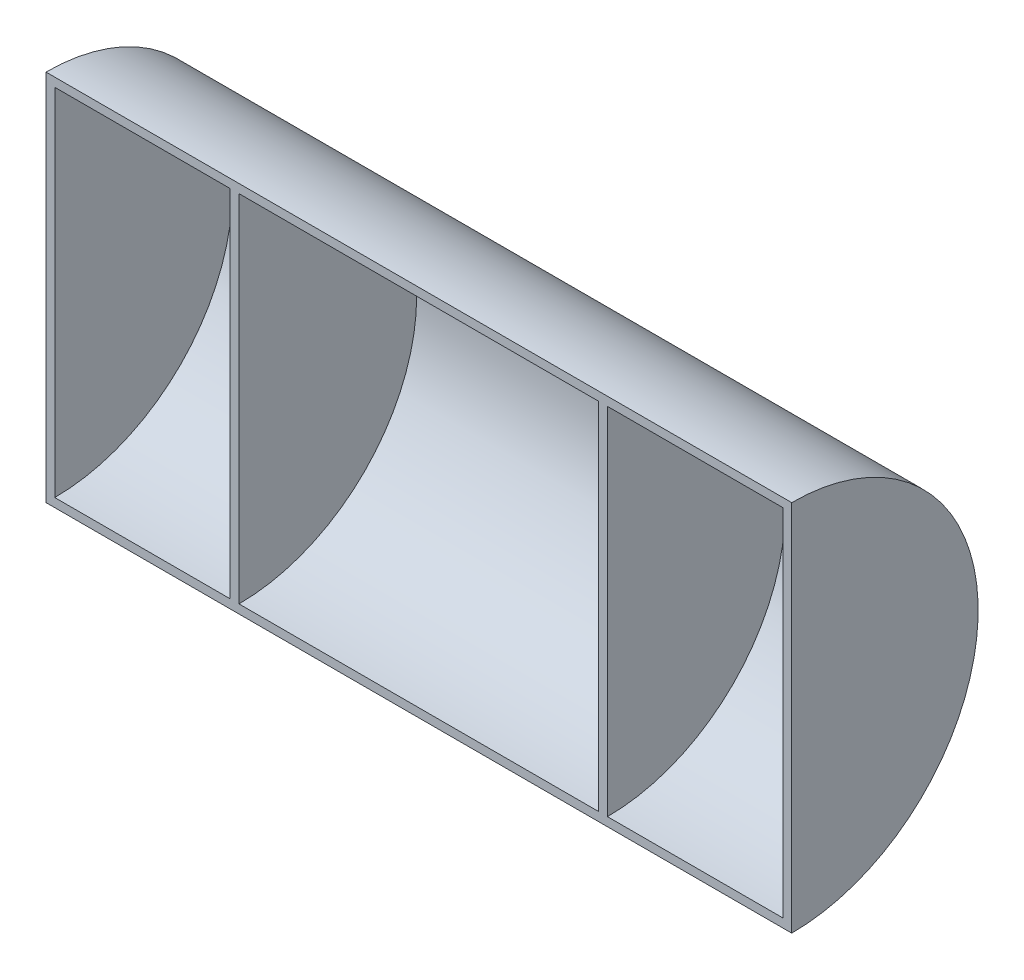
ISO-10303-21;
HEADER;
FILE_DESCRIPTION(('STEP AP214'),'2;1');
FILE_NAME('part.step','',(''),(''),'','','');
FILE_SCHEMA(('AUTOMOTIVE_DESIGN { 1 0 10303 214 1 1 1 1 }'));
ENDSEC;
DATA;
#1=APPLICATION_CONTEXT('core data for automotive mechanical design processes');
#2=APPLICATION_PROTOCOL_DEFINITION('international standard','automotive_design',2000,#1);
#3=PRODUCT_CONTEXT('',#1,'mechanical');
#4=PRODUCT('Part','Part','',(#3));
#5=PRODUCT_RELATED_PRODUCT_CATEGORY('part','',(#4));
#6=PRODUCT_DEFINITION_FORMATION('','',#4);
#7=PRODUCT_DEFINITION_CONTEXT('part definition',#1,'design');
#8=PRODUCT_DEFINITION('design','',#6,#7);
#9=PRODUCT_DEFINITION_SHAPE('','',#8);
#10=(LENGTH_UNIT() NAMED_UNIT(*) SI_UNIT(.MILLI.,.METRE.));
#11=(NAMED_UNIT(*) PLANE_ANGLE_UNIT() SI_UNIT($,.RADIAN.));
#12=(NAMED_UNIT(*) SI_UNIT($,.STERADIAN.) SOLID_ANGLE_UNIT());
#13=UNCERTAINTY_MEASURE_WITH_UNIT(LENGTH_MEASURE(1.E-05),#10,'distance_accuracy_value','');
#14=(GEOMETRIC_REPRESENTATION_CONTEXT(3) GLOBAL_UNCERTAINTY_ASSIGNED_CONTEXT((#13)) GLOBAL_UNIT_ASSIGNED_CONTEXT((#10,
#11,#12)) REPRESENTATION_CONTEXT('',''));
#15=CARTESIAN_POINT('',(0.,0.,0.));
#16=DIRECTION('',(0.,0.,1.));
#17=DIRECTION('',(1.,0.,0.));
#18=AXIS2_PLACEMENT_3D('',#15,#16,#17);
#19=CARTESIAN_POINT('',(-170.,0.,0.));
#20=DIRECTION('',(1.,0.,0.));
#21=DIRECTION('',(0.,0.,-1.));
#22=AXIS2_PLACEMENT_3D('',#19,#20,#21);
#23=CYLINDRICAL_SURFACE('',#22,40.5);
#24=DIRECTION('',(1.,0.,0.));
#25=VECTOR('',#24,1.);
#26=CARTESIAN_POINT('',(-168.,-40.5,0.));
#27=LINE('',#26,#25);
#28=CARTESIAN_POINT('',(-126.,-40.5,0.));
#29=VERTEX_POINT('',#28);
#30=CARTESIAN_POINT('',(-44.,-40.5,0.));
#31=VERTEX_POINT('',#30);
#32=EDGE_CURVE('E111',#29,#31,#27,.T.);
#33=ORIENTED_EDGE('',*,*,#32,.T.);
#34=CARTESIAN_POINT('',(-44.,0.,0.));
#35=DIRECTION('',(-1.,0.,0.));
#36=DIRECTION('',(0.,0.,1.));
#37=AXIS2_PLACEMENT_3D('',#34,#35,#36);
#38=CIRCLE('',#37,40.5);
#39=CARTESIAN_POINT('',(-44.,40.5,0.));
#40=VERTEX_POINT('',#39);
#41=EDGE_CURVE('E102',#40,#31,#38,.T.);
#42=ORIENTED_EDGE('',*,*,#41,.F.);
#43=DIRECTION('',(1.,0.,0.));
#44=VECTOR('',#43,1.);
#45=CARTESIAN_POINT('',(-168.,40.5,0.));
#46=LINE('',#45,#44);
#47=CARTESIAN_POINT('',(-126.,40.5,0.));
#48=VERTEX_POINT('',#47);
#49=EDGE_CURVE('E110',#48,#40,#46,.T.);
#50=ORIENTED_EDGE('',*,*,#49,.F.);
#51=CARTESIAN_POINT('',(-126.,0.,0.));
#52=DIRECTION('',(1.,0.,0.));
#53=DIRECTION('',(0.,0.,-1.));
#54=AXIS2_PLACEMENT_3D('',#51,#52,#53);
#55=CIRCLE('',#54,40.5);
#56=EDGE_CURVE('E190',#29,#48,#55,.T.);
#57=ORIENTED_EDGE('',*,*,#56,.F.);
#58=EDGE_LOOP('',(#33,#42,#50,#57));
#59=FACE_BOUND('',#58,.T.);
#60=ADVANCED_FACE('F36',(#59),#23,.F.);
#61=CARTESIAN_POINT('',(-168.,-40.5,0.));
#62=VERTEX_POINT('',#61);
#63=CARTESIAN_POINT('',(-128.,-40.5,0.));
#64=VERTEX_POINT('',#63);
#65=EDGE_CURVE('E138',#62,#64,#27,.T.);
#66=ORIENTED_EDGE('',*,*,#65,.T.);
#67=CARTESIAN_POINT('',(-128.,0.,0.));
#68=DIRECTION('',(-1.,0.,0.));
#69=DIRECTION('',(0.,0.,1.));
#70=AXIS2_PLACEMENT_3D('',#67,#68,#69);
#71=CIRCLE('',#70,40.5);
#72=CARTESIAN_POINT('',(-128.,40.5,0.));
#73=VERTEX_POINT('',#72);
#74=EDGE_CURVE('E187',#73,#64,#71,.T.);
#75=ORIENTED_EDGE('',*,*,#74,.F.);
#76=CARTESIAN_POINT('',(-168.,40.5,0.));
#77=VERTEX_POINT('',#76);
#78=EDGE_CURVE('E116',#77,#73,#46,.T.);
#79=ORIENTED_EDGE('',*,*,#78,.F.);
#80=CARTESIAN_POINT('',(-168.,0.,0.));
#81=DIRECTION('',(1.,0.,0.));
#82=DIRECTION('',(0.,0.,-1.));
#83=AXIS2_PLACEMENT_3D('',#80,#81,#82);
#84=CIRCLE('',#83,40.5);
#85=EDGE_CURVE('E127',#62,#77,#84,.T.);
#86=ORIENTED_EDGE('',*,*,#85,.F.);
#87=EDGE_LOOP('',(#66,#75,#79,#86));
#88=FACE_BOUND('',#87,.T.);
#89=ADVANCED_FACE('F160',(#88),#23,.F.);
#90=CARTESIAN_POINT('',(-170.,42.5,0.));
#91=DIRECTION('',(0.,0.,1.));
#92=DIRECTION('',(1.,0.,0.));
#93=AXIS2_PLACEMENT_3D('',#90,#91,#92);
#94=PLANE('',#93);
#95=CARTESIAN_POINT('',(-42.,-40.5,0.));
#96=VERTEX_POINT('',#95);
#97=CARTESIAN_POINT('',(-2.,-40.5,0.));
#98=VERTEX_POINT('',#97);
#99=EDGE_CURVE('E120',#96,#98,#27,.T.);
#100=ORIENTED_EDGE('',*,*,#99,.F.);
#101=DIRECTION('',(0.,1.,0.));
#102=VECTOR('',#101,1.);
#103=CARTESIAN_POINT('',(-42.,40.5,0.));
#104=LINE('',#103,#102);
#105=CARTESIAN_POINT('',(-42.,40.5,0.));
#106=VERTEX_POINT('',#105);
#107=EDGE_CURVE('E50',#96,#106,#104,.T.);
#108=ORIENTED_EDGE('',*,*,#107,.T.);
#109=CARTESIAN_POINT('',(-2.,40.5,0.));
#110=VERTEX_POINT('',#109);
#111=EDGE_CURVE('E117',#106,#110,#46,.T.);
#112=ORIENTED_EDGE('',*,*,#111,.T.);
#113=DIRECTION('',(0.,-1.,0.));
#114=VECTOR('',#113,1.);
#115=CARTESIAN_POINT('',(-2.,0.,0.));
#116=LINE('',#115,#114);
#117=EDGE_CURVE('E124',#110,#98,#116,.T.);
#118=ORIENTED_EDGE('',*,*,#117,.T.);
#119=EDGE_LOOP('',(#100,#108,#112,#118));
#120=FACE_BOUND('',#119,.T.);
#121=ORIENTED_EDGE('',*,*,#32,.F.);
#122=DIRECTION('',(0.,1.,0.));
#123=VECTOR('',#122,1.);
#124=CARTESIAN_POINT('',(-126.,40.5,0.));
#125=LINE('',#124,#123);
#126=EDGE_CURVE('E57',#29,#48,#125,.T.);
#127=ORIENTED_EDGE('',*,*,#126,.T.);
#128=ORIENTED_EDGE('',*,*,#49,.T.);
#129=DIRECTION('',(0.,-1.,0.));
#130=VECTOR('',#129,1.);
#131=CARTESIAN_POINT('',(-44.,40.5,0.));
#132=LINE('',#131,#130);
#133=EDGE_CURVE('E99',#40,#31,#132,.T.);
#134=ORIENTED_EDGE('',*,*,#133,.T.);
#135=EDGE_LOOP('',(#121,#127,#128,#134));
#136=FACE_BOUND('',#135,.T.);
#137=DIRECTION('',(0.,-1.,0.));
#138=VECTOR('',#137,1.);
#139=CARTESIAN_POINT('',(0.,42.5,0.));
#140=LINE('',#139,#138);
#141=CARTESIAN_POINT('',(0.,42.5,0.));
#142=VERTEX_POINT('',#141);
#143=CARTESIAN_POINT('',(0.,-42.5,0.));
#144=VERTEX_POINT('',#143);
#145=EDGE_CURVE('E132',#142,#144,#140,.T.);
#146=ORIENTED_EDGE('',*,*,#145,.F.);
#147=DIRECTION('',(1.,0.,0.));
#148=VECTOR('',#147,1.);
#149=CARTESIAN_POINT('',(-170.,42.5,0.));
#150=LINE('',#149,#148);
#151=CARTESIAN_POINT('',(-170.,42.5,0.));
#152=VERTEX_POINT('',#151);
#153=EDGE_CURVE('E40',#152,#142,#150,.T.);
#154=ORIENTED_EDGE('',*,*,#153,.F.);
#155=DIRECTION('',(0.,-1.,0.));
#156=VECTOR('',#155,1.);
#157=CARTESIAN_POINT('',(-170.,42.5,0.));
#158=LINE('',#157,#156);
#159=CARTESIAN_POINT('',(-170.,-42.5,0.));
#160=VERTEX_POINT('',#159);
#161=EDGE_CURVE('E131',#152,#160,#158,.T.);
#162=ORIENTED_EDGE('',*,*,#161,.T.);
#163=DIRECTION('',(1.,0.,0.));
#164=VECTOR('',#163,1.);
#165=CARTESIAN_POINT('',(-170.,-42.5,0.));
#166=LINE('',#165,#164);
#167=EDGE_CURVE('E11',#160,#144,#166,.T.);
#168=ORIENTED_EDGE('',*,*,#167,.T.);
#169=EDGE_LOOP('',(#146,#154,#162,#168));
#170=FACE_BOUND('',#169,.T.);
#171=ORIENTED_EDGE('',*,*,#78,.T.);
#172=DIRECTION('',(0.,-1.,0.));
#173=VECTOR('',#172,1.);
#174=CARTESIAN_POINT('',(-128.,40.5,0.));
#175=LINE('',#174,#173);
#176=EDGE_CURVE('E191',#73,#64,#175,.T.);
#177=ORIENTED_EDGE('',*,*,#176,.T.);
#178=ORIENTED_EDGE('',*,*,#65,.F.);
#179=DIRECTION('',(0.,-1.,0.));
#180=VECTOR('',#179,1.);
#181=CARTESIAN_POINT('',(-168.,0.,0.));
#182=LINE('',#181,#180);
#183=EDGE_CURVE('E121',#77,#62,#182,.T.);
#184=ORIENTED_EDGE('',*,*,#183,.F.);
#185=EDGE_LOOP('',(#171,#177,#178,#184));
#186=FACE_BOUND('',#185,.T.);
#187=ADVANCED_FACE('F114',(#120,#136,#170,#186),#94,.T.);
#188=CARTESIAN_POINT('',(-170.,0.,0.));
#189=DIRECTION('',(1.,0.,0.));
#190=DIRECTION('',(0.,0.,-1.));
#191=AXIS2_PLACEMENT_3D('',#188,#189,#190);
#192=CYLINDRICAL_SURFACE('',#191,42.5);
#193=CARTESIAN_POINT('',(0.,0.,0.));
#194=DIRECTION('',(1.,0.,0.));
#195=DIRECTION('',(0.,0.,-1.));
#196=AXIS2_PLACEMENT_3D('',#193,#194,#195);
#197=CIRCLE('',#196,42.5);
#198=EDGE_CURVE('E135',#144,#142,#197,.T.);
#199=ORIENTED_EDGE('',*,*,#198,.F.);
#200=ORIENTED_EDGE('',*,*,#167,.F.);
#201=CARTESIAN_POINT('',(-170.,0.,0.));
#202=DIRECTION('',(1.,0.,0.));
#203=DIRECTION('',(0.,0.,-1.));
#204=AXIS2_PLACEMENT_3D('',#201,#202,#203);
#205=CIRCLE('',#204,42.5);
#206=EDGE_CURVE('E128',#160,#152,#205,.T.);
#207=ORIENTED_EDGE('',*,*,#206,.T.);
#208=ORIENTED_EDGE('',*,*,#153,.T.);
#209=EDGE_LOOP('',(#199,#200,#207,#208));
#210=FACE_BOUND('',#209,.T.);
#211=ADVANCED_FACE('F38',(#210),#192,.T.);
#212=CARTESIAN_POINT('',(-170.,0.,0.));
#213=DIRECTION('',(1.,0.,0.));
#214=DIRECTION('',(0.,0.,-1.));
#215=AXIS2_PLACEMENT_3D('',#212,#213,#214);
#216=PLANE('',#215);
#217=ORIENTED_EDGE('',*,*,#206,.F.);
#218=ORIENTED_EDGE('',*,*,#161,.F.);
#219=EDGE_LOOP('',(#217,#218));
#220=FACE_BOUND('',#219,.T.);
#221=ADVANCED_FACE('F149',(#220),#216,.F.);
#222=CARTESIAN_POINT('',(0.,0.,0.));
#223=DIRECTION('',(1.,0.,0.));
#224=DIRECTION('',(0.,0.,-1.));
#225=AXIS2_PLACEMENT_3D('',#222,#223,#224);
#226=PLANE('',#225);
#227=ORIENTED_EDGE('',*,*,#198,.T.);
#228=ORIENTED_EDGE('',*,*,#145,.T.);
#229=EDGE_LOOP('',(#227,#228));
#230=FACE_BOUND('',#229,.T.);
#231=ADVANCED_FACE('F142',(#230),#226,.T.);
#232=ORIENTED_EDGE('',*,*,#111,.F.);
#233=CARTESIAN_POINT('',(-42.,0.,0.));
#234=DIRECTION('',(1.,0.,0.));
#235=DIRECTION('',(0.,1.,0.));
#236=AXIS2_PLACEMENT_3D('',#233,#234,#235);
#237=CIRCLE('',#236,40.5);
#238=EDGE_CURVE('E112',#96,#106,#237,.T.);
#239=ORIENTED_EDGE('',*,*,#238,.F.);
#240=ORIENTED_EDGE('',*,*,#99,.T.);
#241=CARTESIAN_POINT('',(-2.,0.,0.));
#242=DIRECTION('',(1.,0.,0.));
#243=DIRECTION('',(0.,0.,-1.));
#244=AXIS2_PLACEMENT_3D('',#241,#242,#243);
#245=CIRCLE('',#244,40.5);
#246=EDGE_CURVE('E180',#98,#110,#245,.T.);
#247=ORIENTED_EDGE('',*,*,#246,.T.);
#248=EDGE_LOOP('',(#232,#239,#240,#247));
#249=FACE_BOUND('',#248,.T.);
#250=ADVANCED_FACE('F156',(#249),#23,.F.);
#251=CARTESIAN_POINT('',(-168.,0.,0.));
#252=DIRECTION('',(1.,0.,0.));
#253=DIRECTION('',(0.,0.,-1.));
#254=AXIS2_PLACEMENT_3D('',#251,#252,#253);
#255=PLANE('',#254);
#256=ORIENTED_EDGE('',*,*,#85,.T.);
#257=ORIENTED_EDGE('',*,*,#183,.T.);
#258=EDGE_LOOP('',(#256,#257));
#259=FACE_BOUND('',#258,.T.);
#260=ADVANCED_FACE('F169',(#259),#255,.T.);
#261=CARTESIAN_POINT('',(-2.,0.,0.));
#262=DIRECTION('',(1.,0.,0.));
#263=DIRECTION('',(0.,0.,-1.));
#264=AXIS2_PLACEMENT_3D('',#261,#262,#263);
#265=PLANE('',#264);
#266=ORIENTED_EDGE('',*,*,#246,.F.);
#267=ORIENTED_EDGE('',*,*,#117,.F.);
#268=EDGE_LOOP('',(#266,#267));
#269=FACE_BOUND('',#268,.T.);
#270=ADVANCED_FACE('F174',(#269),#265,.F.);
#271=CARTESIAN_POINT('',(-128.,40.5,-42.501));
#272=DIRECTION('',(-1.,0.,0.));
#273=DIRECTION('',(0.,0.,1.));
#274=AXIS2_PLACEMENT_3D('',#271,#272,#273);
#275=PLANE('',#274);
#276=ORIENTED_EDGE('',*,*,#176,.F.);
#277=ORIENTED_EDGE('',*,*,#74,.T.);
#278=EDGE_LOOP('',(#276,#277));
#279=FACE_BOUND('',#278,.T.);
#280=ADVANCED_FACE('F203',(#279),#275,.T.);
#281=CARTESIAN_POINT('',(-126.,40.5,-42.501));
#282=DIRECTION('',(1.,0.,0.));
#283=DIRECTION('',(0.,0.,-1.));
#284=AXIS2_PLACEMENT_3D('',#281,#282,#283);
#285=PLANE('',#284);
#286=ORIENTED_EDGE('',*,*,#126,.F.);
#287=ORIENTED_EDGE('',*,*,#56,.T.);
#288=EDGE_LOOP('',(#286,#287));
#289=FACE_BOUND('',#288,.T.);
#290=ADVANCED_FACE('F207',(#289),#285,.T.);
#291=CARTESIAN_POINT('',(-44.,40.5,-42.501));
#292=DIRECTION('',(-1.,0.,0.));
#293=DIRECTION('',(0.,0.,1.));
#294=AXIS2_PLACEMENT_3D('',#291,#292,#293);
#295=PLANE('',#294);
#296=ORIENTED_EDGE('',*,*,#133,.F.);
#297=ORIENTED_EDGE('',*,*,#41,.T.);
#298=EDGE_LOOP('',(#296,#297));
#299=FACE_BOUND('',#298,.T.);
#300=ADVANCED_FACE('F101',(#299),#295,.T.);
#301=CARTESIAN_POINT('',(-42.,40.5,-42.501));
#302=DIRECTION('',(1.,0.,0.));
#303=DIRECTION('',(0.,1.,0.));
#304=AXIS2_PLACEMENT_3D('',#301,#302,#303);
#305=PLANE('',#304);
#306=ORIENTED_EDGE('',*,*,#107,.F.);
#307=ORIENTED_EDGE('',*,*,#238,.T.);
#308=EDGE_LOOP('',(#306,#307));
#309=FACE_BOUND('',#308,.T.);
#310=ADVANCED_FACE('F214',(#309),#305,.T.);
#311=CLOSED_SHELL('',(#60,#89,#187,#211,#221,#231,#250,#260,#270,#280,#290,#300,#310));
#312=MANIFOLD_SOLID_BREP('B2',#311);
#313=ADVANCED_BREP_SHAPE_REPRESENTATION('',(#18,#312),#14);
#314=SHAPE_DEFINITION_REPRESENTATION(#9,#313);
ENDSEC;
END-ISO-10303-21;
